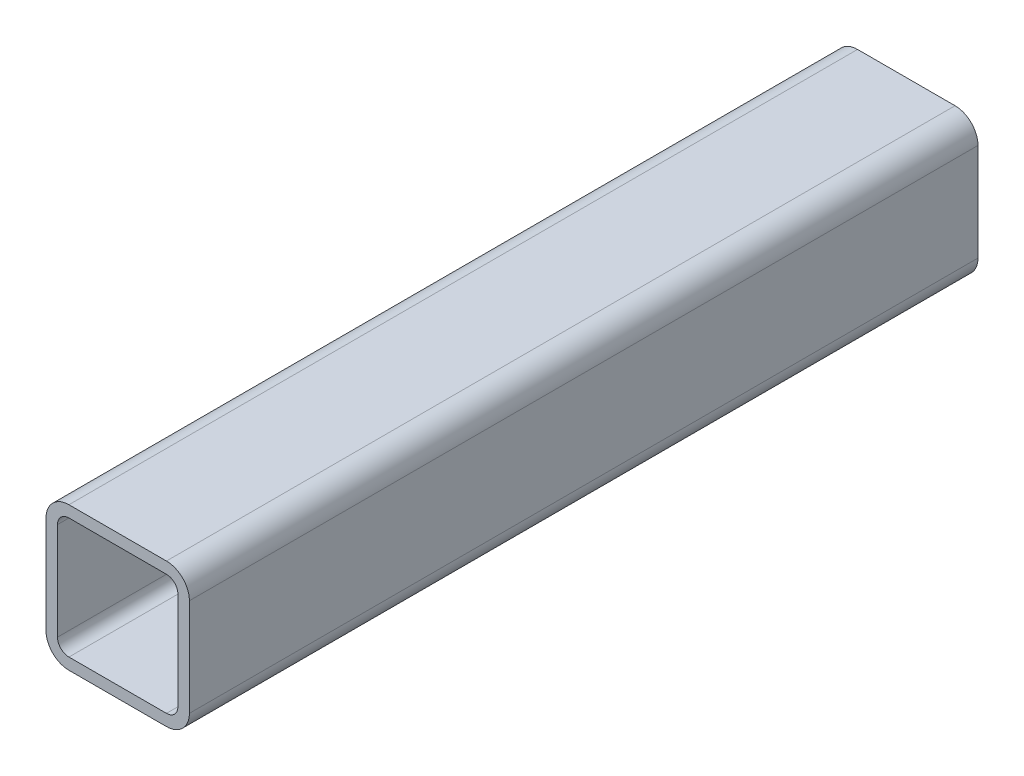
ISO-10303-21;
HEADER;
FILE_DESCRIPTION(('STEP AP214'),'2;1');
FILE_NAME('part.step','',(''),(''),'','','');
FILE_SCHEMA(('AUTOMOTIVE_DESIGN { 1 0 10303 214 1 1 1 1 }'));
ENDSEC;
DATA;
#1=APPLICATION_CONTEXT('core data for automotive mechanical design processes');
#2=APPLICATION_PROTOCOL_DEFINITION('international standard','automotive_design',2000,#1);
#3=PRODUCT_CONTEXT('',#1,'mechanical');
#4=PRODUCT('Part','Part','',(#3));
#5=PRODUCT_RELATED_PRODUCT_CATEGORY('part','',(#4));
#6=PRODUCT_DEFINITION_FORMATION('','',#4);
#7=PRODUCT_DEFINITION_CONTEXT('part definition',#1,'design');
#8=PRODUCT_DEFINITION('design','',#6,#7);
#9=PRODUCT_DEFINITION_SHAPE('','',#8);
#10=(LENGTH_UNIT() NAMED_UNIT(*) SI_UNIT(.MILLI.,.METRE.));
#11=(NAMED_UNIT(*) PLANE_ANGLE_UNIT() SI_UNIT($,.RADIAN.));
#12=(NAMED_UNIT(*) SI_UNIT($,.STERADIAN.) SOLID_ANGLE_UNIT());
#13=UNCERTAINTY_MEASURE_WITH_UNIT(LENGTH_MEASURE(1.E-05),#10,'distance_accuracy_value','');
#14=(GEOMETRIC_REPRESENTATION_CONTEXT(3) GLOBAL_UNCERTAINTY_ASSIGNED_CONTEXT((#13)) GLOBAL_UNIT_ASSIGNED_CONTEXT((#10,
#11,#12)) REPRESENTATION_CONTEXT('',''));
#15=CARTESIAN_POINT('',(0.,0.,0.));
#16=DIRECTION('',(0.,0.,1.));
#17=DIRECTION('',(1.,0.,0.));
#18=AXIS2_PLACEMENT_3D('',#15,#16,#17);
#19=CARTESIAN_POINT('',(-379.733333333333,896.4,620.));
#20=DIRECTION('',(0.,0.,1.));
#21=DIRECTION('',(1.,0.,0.));
#22=AXIS2_PLACEMENT_3D('',#19,#20,#21);
#23=CYLINDRICAL_SURFACE('',#22,6.39999999999996);
#24=CARTESIAN_POINT('',(-379.733333333333,896.4,860.));
#25=DIRECTION('',(0.,0.,1.));
#26=DIRECTION('',(1.,0.,0.));
#27=AXIS2_PLACEMENT_3D('',#24,#25,#26);
#28=CIRCLE('',#27,6.39999999999996);
#29=CARTESIAN_POINT('',(-379.733333333333,890.,860.));
#30=VERTEX_POINT('',#29);
#31=CARTESIAN_POINT('',(-373.333333333333,896.4,860.));
#32=VERTEX_POINT('',#31);
#33=EDGE_CURVE('E121',#30,#32,#28,.T.);
#34=ORIENTED_EDGE('',*,*,#33,.F.);
#35=DIRECTION('',(0.,0.,1.));
#36=VECTOR('',#35,1.);
#37=CARTESIAN_POINT('',(-379.733333333333,890.,620.));
#38=LINE('',#37,#36);
#39=CARTESIAN_POINT('',(-379.733333333333,890.,640.));
#40=VERTEX_POINT('',#39);
#41=EDGE_CURVE('E118',#30,#40,#38,.F.);
#42=ORIENTED_EDGE('',*,*,#41,.T.);
#43=CARTESIAN_POINT('',(-379.733333333333,896.4,640.));
#44=DIRECTION('',(0.,0.,1.));
#45=DIRECTION('',(1.,0.,0.));
#46=AXIS2_PLACEMENT_3D('',#43,#44,#45);
#47=CIRCLE('',#46,6.39999999999996);
#48=CARTESIAN_POINT('',(-373.333333333333,896.4,640.));
#49=VERTEX_POINT('',#48);
#50=EDGE_CURVE('E22',#49,#40,#47,.F.);
#51=ORIENTED_EDGE('',*,*,#50,.F.);
#52=DIRECTION('',(0.,0.,1.));
#53=VECTOR('',#52,1.);
#54=CARTESIAN_POINT('',(-373.333333333333,896.4,620.));
#55=LINE('',#54,#53);
#56=EDGE_CURVE('E218',#49,#32,#55,.T.);
#57=ORIENTED_EDGE('',*,*,#56,.T.);
#58=EDGE_LOOP('',(#34,#42,#51,#57));
#59=FACE_BOUND('',#58,.T.);
#60=ADVANCED_FACE('F19',(#59),#23,.T.);
#61=CARTESIAN_POINT('',(-373.333333333333,896.4,620.));
#62=DIRECTION('',(-1.,0.,0.));
#63=DIRECTION('',(0.,0.,1.));
#64=AXIS2_PLACEMENT_3D('',#61,#62,#63);
#65=PLANE('',#64);
#66=DIRECTION('',(0.,1.,0.));
#67=VECTOR('',#66,1.);
#68=CARTESIAN_POINT('',(-373.333333333333,896.4,640.));
#69=LINE('',#68,#67);
#70=CARTESIAN_POINT('',(-373.333333333333,923.6,640.));
#71=VERTEX_POINT('',#70);
#72=EDGE_CURVE('E140',#71,#49,#69,.F.);
#73=ORIENTED_EDGE('',*,*,#72,.F.);
#74=DIRECTION('',(0.,0.,1.));
#75=VECTOR('',#74,1.);
#76=CARTESIAN_POINT('',(-373.333333333333,923.6,620.));
#77=LINE('',#76,#75);
#78=CARTESIAN_POINT('',(-373.333333333333,923.6,860.));
#79=VERTEX_POINT('',#78);
#80=EDGE_CURVE('E217',#79,#71,#77,.F.);
#81=ORIENTED_EDGE('',*,*,#80,.F.);
#82=DIRECTION('',(0.,-1.,0.));
#83=VECTOR('',#82,1.);
#84=CARTESIAN_POINT('',(-373.333333333333,910.,860.));
#85=LINE('',#84,#83);
#86=EDGE_CURVE('E194',#32,#79,#85,.F.);
#87=ORIENTED_EDGE('',*,*,#86,.F.);
#88=ORIENTED_EDGE('',*,*,#56,.F.);
#89=EDGE_LOOP('',(#73,#81,#87,#88));
#90=FACE_BOUND('',#89,.T.);
#91=ADVANCED_FACE('F279',(#90),#65,.F.);
#92=CARTESIAN_POINT('',(-379.733333333333,923.6,620.));
#93=DIRECTION('',(0.,0.,1.));
#94=DIRECTION('',(1.,0.,0.));
#95=AXIS2_PLACEMENT_3D('',#92,#93,#94);
#96=CYLINDRICAL_SURFACE('',#95,6.39999999999996);
#97=CARTESIAN_POINT('',(-379.733333333333,923.6,860.));
#98=DIRECTION('',(0.,0.,1.));
#99=DIRECTION('',(1.,0.,0.));
#100=AXIS2_PLACEMENT_3D('',#97,#98,#99);
#101=CIRCLE('',#100,6.39999999999996);
#102=CARTESIAN_POINT('',(-379.733333333333,930.,860.));
#103=VERTEX_POINT('',#102);
#104=EDGE_CURVE('E242',#79,#103,#101,.T.);
#105=ORIENTED_EDGE('',*,*,#104,.F.);
#106=ORIENTED_EDGE('',*,*,#80,.T.);
#107=CARTESIAN_POINT('',(-379.733333333333,923.6,640.));
#108=DIRECTION('',(0.,0.,1.));
#109=DIRECTION('',(1.,0.,0.));
#110=AXIS2_PLACEMENT_3D('',#107,#108,#109);
#111=CIRCLE('',#110,6.39999999999996);
#112=CARTESIAN_POINT('',(-379.733333333333,930.,640.));
#113=VERTEX_POINT('',#112);
#114=EDGE_CURVE('E170',#113,#71,#111,.F.);
#115=ORIENTED_EDGE('',*,*,#114,.F.);
#116=DIRECTION('',(0.,0.,-1.));
#117=VECTOR('',#116,1.);
#118=CARTESIAN_POINT('',(-379.733333333333,930.,620.));
#119=LINE('',#118,#117);
#120=EDGE_CURVE('E215',#113,#103,#119,.F.);
#121=ORIENTED_EDGE('',*,*,#120,.T.);
#122=EDGE_LOOP('',(#105,#106,#115,#121));
#123=FACE_BOUND('',#122,.T.);
#124=ADVANCED_FACE('F275',(#123),#96,.T.);
#125=CARTESIAN_POINT('',(-406.933333333334,930.,620.));
#126=DIRECTION('',(0.,-1.,0.));
#127=DIRECTION('',(0.,0.,-1.));
#128=AXIS2_PLACEMENT_3D('',#125,#126,#127);
#129=PLANE('',#128);
#130=DIRECTION('',(1.,0.,0.));
#131=VECTOR('',#130,1.);
#132=CARTESIAN_POINT('',(1180.,930.,640.));
#133=LINE('',#132,#131);
#134=CARTESIAN_POINT('',(-406.933333333334,930.,640.));
#135=VERTEX_POINT('',#134);
#136=EDGE_CURVE('E166',#135,#113,#133,.T.);
#137=ORIENTED_EDGE('',*,*,#136,.F.);
#138=DIRECTION('',(0.,0.,1.));
#139=VECTOR('',#138,1.);
#140=CARTESIAN_POINT('',(-406.933333333334,930.,620.));
#141=LINE('',#140,#139);
#142=CARTESIAN_POINT('',(-406.933333333333,930.,860.));
#143=VERTEX_POINT('',#142);
#144=EDGE_CURVE('E213',#143,#135,#141,.F.);
#145=ORIENTED_EDGE('',*,*,#144,.F.);
#146=DIRECTION('',(1.,0.,0.));
#147=VECTOR('',#146,1.);
#148=CARTESIAN_POINT('',(-406.933333333333,930.,860.));
#149=LINE('',#148,#147);
#150=EDGE_CURVE('E241',#103,#143,#149,.F.);
#151=ORIENTED_EDGE('',*,*,#150,.F.);
#152=ORIENTED_EDGE('',*,*,#120,.F.);
#153=EDGE_LOOP('',(#137,#145,#151,#152));
#154=FACE_BOUND('',#153,.T.);
#155=ADVANCED_FACE('F270',(#154),#129,.F.);
#156=CARTESIAN_POINT('',(-406.933333333334,923.6,620.));
#157=DIRECTION('',(0.,0.,1.));
#158=DIRECTION('',(1.,0.,0.));
#159=AXIS2_PLACEMENT_3D('',#156,#157,#158);
#160=CYLINDRICAL_SURFACE('',#159,6.39999999999996);
#161=CARTESIAN_POINT('',(-406.933333333333,923.6,860.));
#162=DIRECTION('',(0.,0.,1.));
#163=DIRECTION('',(1.,0.,0.));
#164=AXIS2_PLACEMENT_3D('',#161,#162,#163);
#165=CIRCLE('',#164,6.39999999999996);
#166=CARTESIAN_POINT('',(-413.333333333333,923.6,860.));
#167=VERTEX_POINT('',#166);
#168=EDGE_CURVE('E238',#143,#167,#165,.T.);
#169=ORIENTED_EDGE('',*,*,#168,.F.);
#170=ORIENTED_EDGE('',*,*,#144,.T.);
#171=CARTESIAN_POINT('',(-406.933333333333,923.6,640.));
#172=DIRECTION('',(0.,0.,1.));
#173=DIRECTION('',(1.,0.,0.));
#174=AXIS2_PLACEMENT_3D('',#171,#172,#173);
#175=CIRCLE('',#174,6.39999999999996);
#176=CARTESIAN_POINT('',(-413.333333333333,923.6,640.));
#177=VERTEX_POINT('',#176);
#178=EDGE_CURVE('E165',#177,#135,#175,.F.);
#179=ORIENTED_EDGE('',*,*,#178,.F.);
#180=DIRECTION('',(0.,0.,-1.));
#181=VECTOR('',#180,1.);
#182=CARTESIAN_POINT('',(-413.333333333333,923.6,620.));
#183=LINE('',#182,#181);
#184=EDGE_CURVE('E211',#177,#167,#183,.F.);
#185=ORIENTED_EDGE('',*,*,#184,.T.);
#186=EDGE_LOOP('',(#169,#170,#179,#185));
#187=FACE_BOUND('',#186,.T.);
#188=ADVANCED_FACE('F266',(#187),#160,.T.);
#189=CARTESIAN_POINT('',(-413.333333333333,923.6,620.));
#190=DIRECTION('',(1.,0.,0.));
#191=DIRECTION('',(0.,0.,-1.));
#192=AXIS2_PLACEMENT_3D('',#189,#190,#191);
#193=PLANE('',#192);
#194=DIRECTION('',(0.,1.,0.));
#195=VECTOR('',#194,1.);
#196=CARTESIAN_POINT('',(-413.333333333333,896.4,640.));
#197=LINE('',#196,#195);
#198=CARTESIAN_POINT('',(-413.333333333333,896.4,640.));
#199=VERTEX_POINT('',#198);
#200=EDGE_CURVE('E162',#199,#177,#197,.T.);
#201=ORIENTED_EDGE('',*,*,#200,.F.);
#202=DIRECTION('',(0.,0.,1.));
#203=VECTOR('',#202,1.);
#204=CARTESIAN_POINT('',(-413.333333333333,896.4,620.));
#205=LINE('',#204,#203);
#206=CARTESIAN_POINT('',(-413.333333333333,896.4,860.));
#207=VERTEX_POINT('',#206);
#208=EDGE_CURVE('E126',#207,#199,#205,.F.);
#209=ORIENTED_EDGE('',*,*,#208,.F.);
#210=DIRECTION('',(0.,-1.,0.));
#211=VECTOR('',#210,1.);
#212=CARTESIAN_POINT('',(-413.333333333333,910.,860.));
#213=LINE('',#212,#211);
#214=EDGE_CURVE('E237',#167,#207,#213,.T.);
#215=ORIENTED_EDGE('',*,*,#214,.F.);
#216=ORIENTED_EDGE('',*,*,#184,.F.);
#217=EDGE_LOOP('',(#201,#209,#215,#216));
#218=FACE_BOUND('',#217,.T.);
#219=ADVANCED_FACE('F262',(#218),#193,.F.);
#220=CARTESIAN_POINT('',(-406.933333333334,896.4,620.));
#221=DIRECTION('',(0.,0.,1.));
#222=DIRECTION('',(1.,0.,0.));
#223=AXIS2_PLACEMENT_3D('',#220,#221,#222);
#224=CYLINDRICAL_SURFACE('',#223,6.40000000000002);
#225=CARTESIAN_POINT('',(-406.933333333333,896.4,860.));
#226=DIRECTION('',(0.,0.,1.));
#227=DIRECTION('',(1.,0.,0.));
#228=AXIS2_PLACEMENT_3D('',#225,#226,#227);
#229=CIRCLE('',#228,6.40000000000002);
#230=CARTESIAN_POINT('',(-406.933333333333,890.,860.));
#231=VERTEX_POINT('',#230);
#232=EDGE_CURVE('E234',#207,#231,#229,.T.);
#233=ORIENTED_EDGE('',*,*,#232,.F.);
#234=ORIENTED_EDGE('',*,*,#208,.T.);
#235=CARTESIAN_POINT('',(-406.933333333333,896.4,640.));
#236=DIRECTION('',(0.,0.,1.));
#237=DIRECTION('',(1.,0.,0.));
#238=AXIS2_PLACEMENT_3D('',#235,#236,#237);
#239=CIRCLE('',#238,6.40000000000002);
#240=CARTESIAN_POINT('',(-406.933333333333,890.,640.));
#241=VERTEX_POINT('',#240);
#242=EDGE_CURVE('E134',#241,#199,#239,.F.);
#243=ORIENTED_EDGE('',*,*,#242,.F.);
#244=DIRECTION('',(0.,0.,1.));
#245=VECTOR('',#244,1.);
#246=CARTESIAN_POINT('',(-406.933333333333,890.,620.));
#247=LINE('',#246,#245);
#248=EDGE_CURVE('E125',#241,#231,#247,.T.);
#249=ORIENTED_EDGE('',*,*,#248,.T.);
#250=EDGE_LOOP('',(#233,#234,#243,#249));
#251=FACE_BOUND('',#250,.T.);
#252=ADVANCED_FACE('F258',(#251),#224,.T.);
#253=CARTESIAN_POINT('',(-379.733333333333,890.,620.));
#254=DIRECTION('',(0.,1.,0.));
#255=DIRECTION('',(0.,0.,1.));
#256=AXIS2_PLACEMENT_3D('',#253,#254,#255);
#257=PLANE('',#256);
#258=DIRECTION('',(1.,0.,0.));
#259=VECTOR('',#258,1.);
#260=CARTESIAN_POINT('',(1180.,890.,640.));
#261=LINE('',#260,#259);
#262=EDGE_CURVE('E129',#40,#241,#261,.F.);
#263=ORIENTED_EDGE('',*,*,#262,.F.);
#264=ORIENTED_EDGE('',*,*,#41,.F.);
#265=DIRECTION('',(1.,0.,0.));
#266=VECTOR('',#265,1.);
#267=CARTESIAN_POINT('',(-406.933333333333,890.,860.));
#268=LINE('',#267,#266);
#269=EDGE_CURVE('E233',#231,#30,#268,.T.);
#270=ORIENTED_EDGE('',*,*,#269,.F.);
#271=ORIENTED_EDGE('',*,*,#248,.F.);
#272=EDGE_LOOP('',(#263,#264,#270,#271));
#273=FACE_BOUND('',#272,.T.);
#274=ADVANCED_FACE('F130',(#273),#257,.F.);
#275=CARTESIAN_POINT('',(-410.133333333333,923.6,620.));
#276=DIRECTION('',(1.,0.,0.));
#277=DIRECTION('',(0.,0.,-1.));
#278=AXIS2_PLACEMENT_3D('',#275,#276,#277);
#279=PLANE('',#278);
#280=DIRECTION('',(0.,0.,1.));
#281=VECTOR('',#280,1.);
#282=CARTESIAN_POINT('',(-410.133333333333,923.6,620.));
#283=LINE('',#282,#281);
#284=CARTESIAN_POINT('',(-410.133333333333,923.6,640.));
#285=VERTEX_POINT('',#284);
#286=CARTESIAN_POINT('',(-410.133333333333,923.6,860.));
#287=VERTEX_POINT('',#286);
#288=EDGE_CURVE('E201',#285,#287,#283,.T.);
#289=ORIENTED_EDGE('',*,*,#288,.T.);
#290=DIRECTION('',(0.,-1.,0.));
#291=VECTOR('',#290,1.);
#292=CARTESIAN_POINT('',(-410.133333333333,910.,860.));
#293=LINE('',#292,#291);
#294=CARTESIAN_POINT('',(-410.133333333333,896.4,860.));
#295=VERTEX_POINT('',#294);
#296=EDGE_CURVE('E231',#295,#287,#293,.F.);
#297=ORIENTED_EDGE('',*,*,#296,.F.);
#298=DIRECTION('',(0.,0.,1.));
#299=VECTOR('',#298,1.);
#300=CARTESIAN_POINT('',(-410.133333333333,896.4,620.));
#301=LINE('',#300,#299);
#302=CARTESIAN_POINT('',(-410.133333333333,896.4,640.));
#303=VERTEX_POINT('',#302);
#304=EDGE_CURVE('E205',#295,#303,#301,.F.);
#305=ORIENTED_EDGE('',*,*,#304,.T.);
#306=DIRECTION('',(0.,1.,0.));
#307=VECTOR('',#306,1.);
#308=CARTESIAN_POINT('',(-410.133333333333,896.4,640.));
#309=LINE('',#308,#307);
#310=EDGE_CURVE('E172',#285,#303,#309,.F.);
#311=ORIENTED_EDGE('',*,*,#310,.F.);
#312=EDGE_LOOP('',(#289,#297,#305,#311));
#313=FACE_BOUND('',#312,.T.);
#314=ADVANCED_FACE('F314',(#313),#279,.T.);
#315=CARTESIAN_POINT('',(-406.933333333334,923.6,620.));
#316=DIRECTION('',(0.,0.,1.));
#317=DIRECTION('',(1.,0.,0.));
#318=AXIS2_PLACEMENT_3D('',#315,#316,#317);
#319=CYLINDRICAL_SURFACE('',#318,3.19999999999993);
#320=ORIENTED_EDGE('',*,*,#288,.F.);
#321=CARTESIAN_POINT('',(-406.933333333333,923.6,640.));
#322=DIRECTION('',(0.,0.,1.));
#323=DIRECTION('',(1.,0.,0.));
#324=AXIS2_PLACEMENT_3D('',#321,#322,#323);
#325=CIRCLE('',#324,3.19999999999993);
#326=CARTESIAN_POINT('',(-406.933333333333,926.8,640.));
#327=VERTEX_POINT('',#326);
#328=EDGE_CURVE('E183',#327,#285,#325,.T.);
#329=ORIENTED_EDGE('',*,*,#328,.F.);
#330=DIRECTION('',(0.,0.,-1.));
#331=VECTOR('',#330,1.);
#332=CARTESIAN_POINT('',(-406.933333333333,926.8,620.));
#333=LINE('',#332,#331);
#334=CARTESIAN_POINT('',(-406.933333333333,926.8,860.));
#335=VERTEX_POINT('',#334);
#336=EDGE_CURVE('E200',#335,#327,#333,.T.);
#337=ORIENTED_EDGE('',*,*,#336,.F.);
#338=CARTESIAN_POINT('',(-406.933333333333,923.6,860.));
#339=DIRECTION('',(0.,0.,1.));
#340=DIRECTION('',(1.,0.,0.));
#341=AXIS2_PLACEMENT_3D('',#338,#339,#340);
#342=CIRCLE('',#341,3.19999999999993);
#343=EDGE_CURVE('E228',#287,#335,#342,.F.);
#344=ORIENTED_EDGE('',*,*,#343,.F.);
#345=EDGE_LOOP('',(#320,#329,#337,#344));
#346=FACE_BOUND('',#345,.T.);
#347=ADVANCED_FACE('F310',(#346),#319,.F.);
#348=CARTESIAN_POINT('',(-406.933333333334,926.8,620.));
#349=DIRECTION('',(0.,-1.,0.));
#350=DIRECTION('',(0.,0.,-1.));
#351=AXIS2_PLACEMENT_3D('',#348,#349,#350);
#352=PLANE('',#351);
#353=DIRECTION('',(0.,0.,1.));
#354=VECTOR('',#353,1.);
#355=CARTESIAN_POINT('',(-379.733333333333,926.8,620.));
#356=LINE('',#355,#354);
#357=CARTESIAN_POINT('',(-379.733333333333,926.8,640.));
#358=VERTEX_POINT('',#357);
#359=CARTESIAN_POINT('',(-379.733333333333,926.8,860.));
#360=VERTEX_POINT('',#359);
#361=EDGE_CURVE('E150',#358,#360,#356,.T.);
#362=ORIENTED_EDGE('',*,*,#361,.T.);
#363=DIRECTION('',(1.,0.,0.));
#364=VECTOR('',#363,1.);
#365=CARTESIAN_POINT('',(-406.933333333333,926.8,860.));
#366=LINE('',#365,#364);
#367=EDGE_CURVE('E227',#335,#360,#366,.T.);
#368=ORIENTED_EDGE('',*,*,#367,.F.);
#369=ORIENTED_EDGE('',*,*,#336,.T.);
#370=DIRECTION('',(1.,0.,0.));
#371=VECTOR('',#370,1.);
#372=CARTESIAN_POINT('',(1180.,926.8,640.));
#373=LINE('',#372,#371);
#374=EDGE_CURVE('E180',#358,#327,#373,.F.);
#375=ORIENTED_EDGE('',*,*,#374,.F.);
#376=EDGE_LOOP('',(#362,#368,#369,#375));
#377=FACE_BOUND('',#376,.T.);
#378=ADVANCED_FACE('F313',(#377),#352,.T.);
#379=CARTESIAN_POINT('',(-379.733333333333,923.6,620.));
#380=DIRECTION('',(0.,0.,1.));
#381=DIRECTION('',(1.,0.,0.));
#382=AXIS2_PLACEMENT_3D('',#379,#380,#381);
#383=CYLINDRICAL_SURFACE('',#382,3.19999999999993);
#384=ORIENTED_EDGE('',*,*,#361,.F.);
#385=CARTESIAN_POINT('',(-379.733333333333,923.6,640.));
#386=DIRECTION('',(0.,0.,1.));
#387=DIRECTION('',(1.,0.,0.));
#388=AXIS2_PLACEMENT_3D('',#385,#386,#387);
#389=CIRCLE('',#388,3.19999999999993);
#390=CARTESIAN_POINT('',(-376.533333333333,923.6,640.));
#391=VERTEX_POINT('',#390);
#392=EDGE_CURVE('E179',#391,#358,#389,.T.);
#393=ORIENTED_EDGE('',*,*,#392,.F.);
#394=DIRECTION('',(0.,0.,1.));
#395=VECTOR('',#394,1.);
#396=CARTESIAN_POINT('',(-376.533333333333,923.6,620.));
#397=LINE('',#396,#395);
#398=CARTESIAN_POINT('',(-376.533333333333,923.6,860.));
#399=VERTEX_POINT('',#398);
#400=EDGE_CURVE('E143',#399,#391,#397,.F.);
#401=ORIENTED_EDGE('',*,*,#400,.F.);
#402=CARTESIAN_POINT('',(-379.733333333333,923.6,860.));
#403=DIRECTION('',(0.,0.,1.));
#404=DIRECTION('',(1.,0.,0.));
#405=AXIS2_PLACEMENT_3D('',#402,#403,#404);
#406=CIRCLE('',#405,3.19999999999993);
#407=EDGE_CURVE('E224',#360,#399,#406,.F.);
#408=ORIENTED_EDGE('',*,*,#407,.F.);
#409=EDGE_LOOP('',(#384,#393,#401,#408));
#410=FACE_BOUND('',#409,.T.);
#411=ADVANCED_FACE('F332',(#410),#383,.F.);
#412=CARTESIAN_POINT('',(-376.533333333333,896.4,620.));
#413=DIRECTION('',(-1.,0.,0.));
#414=DIRECTION('',(0.,0.,1.));
#415=AXIS2_PLACEMENT_3D('',#412,#413,#414);
#416=PLANE('',#415);
#417=DIRECTION('',(0.,0.,1.));
#418=VECTOR('',#417,1.);
#419=CARTESIAN_POINT('',(-376.533333333333,896.4,620.));
#420=LINE('',#419,#418);
#421=CARTESIAN_POINT('',(-376.533333333333,896.4,640.));
#422=VERTEX_POINT('',#421);
#423=CARTESIAN_POINT('',(-376.533333333333,896.4,860.));
#424=VERTEX_POINT('',#423);
#425=EDGE_CURVE('E141',#422,#424,#420,.T.);
#426=ORIENTED_EDGE('',*,*,#425,.T.);
#427=DIRECTION('',(0.,-1.,0.));
#428=VECTOR('',#427,1.);
#429=CARTESIAN_POINT('',(-376.533333333333,910.,860.));
#430=LINE('',#429,#428);
#431=EDGE_CURVE('E223',#399,#424,#430,.T.);
#432=ORIENTED_EDGE('',*,*,#431,.F.);
#433=ORIENTED_EDGE('',*,*,#400,.T.);
#434=DIRECTION('',(0.,1.,0.));
#435=VECTOR('',#434,1.);
#436=CARTESIAN_POINT('',(-376.533333333333,896.4,640.));
#437=LINE('',#436,#435);
#438=EDGE_CURVE('E176',#422,#391,#437,.T.);
#439=ORIENTED_EDGE('',*,*,#438,.F.);
#440=EDGE_LOOP('',(#426,#432,#433,#439));
#441=FACE_BOUND('',#440,.T.);
#442=ADVANCED_FACE('F294',(#441),#416,.T.);
#443=CARTESIAN_POINT('',(-379.733333333333,896.4,620.));
#444=DIRECTION('',(0.,0.,1.));
#445=DIRECTION('',(1.,0.,0.));
#446=AXIS2_PLACEMENT_3D('',#443,#444,#445);
#447=CYLINDRICAL_SURFACE('',#446,3.19999999999993);
#448=ORIENTED_EDGE('',*,*,#425,.F.);
#449=CARTESIAN_POINT('',(-379.733333333333,896.4,640.));
#450=DIRECTION('',(0.,0.,1.));
#451=DIRECTION('',(1.,0.,0.));
#452=AXIS2_PLACEMENT_3D('',#449,#450,#451);
#453=CIRCLE('',#452,3.19999999999993);
#454=CARTESIAN_POINT('',(-379.733333333332,893.2,640.));
#455=VERTEX_POINT('',#454);
#456=EDGE_CURVE('E175',#455,#422,#453,.T.);
#457=ORIENTED_EDGE('',*,*,#456,.F.);
#458=DIRECTION('',(0.,0.,1.));
#459=VECTOR('',#458,1.);
#460=CARTESIAN_POINT('',(-379.733333333331,893.2,620.));
#461=LINE('',#460,#459);
#462=CARTESIAN_POINT('',(-379.733333333332,893.2,860.));
#463=VERTEX_POINT('',#462);
#464=EDGE_CURVE('E187',#463,#455,#461,.F.);
#465=ORIENTED_EDGE('',*,*,#464,.F.);
#466=CARTESIAN_POINT('',(-379.733333333333,896.4,860.));
#467=DIRECTION('',(0.,0.,1.));
#468=DIRECTION('',(1.,0.,0.));
#469=AXIS2_PLACEMENT_3D('',#466,#467,#468);
#470=CIRCLE('',#469,3.19999999999993);
#471=EDGE_CURVE('E189',#424,#463,#470,.F.);
#472=ORIENTED_EDGE('',*,*,#471,.F.);
#473=EDGE_LOOP('',(#448,#457,#465,#472));
#474=FACE_BOUND('',#473,.T.);
#475=ADVANCED_FACE('F323',(#474),#447,.F.);
#476=CARTESIAN_POINT('',(1180.,896.4,640.));
#477=DIRECTION('',(0.,0.,-1.));
#478=DIRECTION('',(0.,1.,0.));
#479=AXIS2_PLACEMENT_3D('',#476,#477,#478);
#480=PLANE('',#479);
#481=ORIENTED_EDGE('',*,*,#374,.T.);
#482=ORIENTED_EDGE('',*,*,#328,.T.);
#483=ORIENTED_EDGE('',*,*,#310,.T.);
#484=CARTESIAN_POINT('',(-406.933333333333,896.4,640.));
#485=DIRECTION('',(0.,0.,1.));
#486=DIRECTION('',(1.,0.,0.));
#487=AXIS2_PLACEMENT_3D('',#484,#485,#486);
#488=CIRCLE('',#487,3.19999999999998);
#489=CARTESIAN_POINT('',(-406.933333333334,893.2,640.));
#490=VERTEX_POINT('',#489);
#491=EDGE_CURVE('E207',#303,#490,#488,.T.);
#492=ORIENTED_EDGE('',*,*,#491,.T.);
#493=DIRECTION('',(1.,0.,0.));
#494=VECTOR('',#493,1.);
#495=CARTESIAN_POINT('',(-379.733333333333,893.2,640.));
#496=LINE('',#495,#494);
#497=EDGE_CURVE('E184',#455,#490,#496,.F.);
#498=ORIENTED_EDGE('',*,*,#497,.F.);
#499=ORIENTED_EDGE('',*,*,#456,.T.);
#500=ORIENTED_EDGE('',*,*,#438,.T.);
#501=ORIENTED_EDGE('',*,*,#392,.T.);
#502=EDGE_LOOP('',(#481,#482,#483,#492,#498,#499,#500,#501));
#503=FACE_BOUND('',#502,.T.);
#504=ORIENTED_EDGE('',*,*,#114,.T.);
#505=ORIENTED_EDGE('',*,*,#72,.T.);
#506=ORIENTED_EDGE('',*,*,#50,.T.);
#507=ORIENTED_EDGE('',*,*,#262,.T.);
#508=ORIENTED_EDGE('',*,*,#242,.T.);
#509=ORIENTED_EDGE('',*,*,#200,.T.);
#510=ORIENTED_EDGE('',*,*,#178,.T.);
#511=ORIENTED_EDGE('',*,*,#136,.T.);
#512=EDGE_LOOP('',(#504,#505,#506,#507,#508,#509,#510,#511));
#513=FACE_BOUND('',#512,.T.);
#514=ADVANCED_FACE('F138',(#503,#513),#480,.T.);
#515=CARTESIAN_POINT('',(-406.933333333334,896.4,620.));
#516=DIRECTION('',(0.,0.,1.));
#517=DIRECTION('',(1.,0.,0.));
#518=AXIS2_PLACEMENT_3D('',#515,#516,#517);
#519=CYLINDRICAL_SURFACE('',#518,3.19999999999998);
#520=DIRECTION('',(0.,0.,1.));
#521=VECTOR('',#520,1.);
#522=CARTESIAN_POINT('',(-406.933333333335,893.2,620.));
#523=LINE('',#522,#521);
#524=CARTESIAN_POINT('',(-406.933333333334,893.2,860.));
#525=VERTEX_POINT('',#524);
#526=EDGE_CURVE('E28',#490,#525,#523,.T.);
#527=ORIENTED_EDGE('',*,*,#526,.F.);
#528=ORIENTED_EDGE('',*,*,#491,.F.);
#529=ORIENTED_EDGE('',*,*,#304,.F.);
#530=CARTESIAN_POINT('',(-406.933333333333,896.4,860.));
#531=DIRECTION('',(0.,0.,1.));
#532=DIRECTION('',(1.,0.,0.));
#533=AXIS2_PLACEMENT_3D('',#530,#531,#532);
#534=CIRCLE('',#533,3.19999999999998);
#535=EDGE_CURVE('E37',#525,#295,#534,.F.);
#536=ORIENTED_EDGE('',*,*,#535,.F.);
#537=EDGE_LOOP('',(#527,#528,#529,#536));
#538=FACE_BOUND('',#537,.T.);
#539=ADVANCED_FACE('F318',(#538),#519,.F.);
#540=CARTESIAN_POINT('',(-406.933333333333,910.,860.));
#541=DIRECTION('',(0.,0.,1.));
#542=DIRECTION('',(0.,-1.,0.));
#543=AXIS2_PLACEMENT_3D('',#540,#541,#542);
#544=PLANE('',#543);
#545=ORIENTED_EDGE('',*,*,#471,.T.);
#546=DIRECTION('',(1.,0.,0.));
#547=VECTOR('',#546,1.);
#548=CARTESIAN_POINT('',(-379.733333333333,893.2,860.));
#549=LINE('',#548,#547);
#550=EDGE_CURVE('E12',#525,#463,#549,.T.);
#551=ORIENTED_EDGE('',*,*,#550,.F.);
#552=ORIENTED_EDGE('',*,*,#535,.T.);
#553=ORIENTED_EDGE('',*,*,#296,.T.);
#554=ORIENTED_EDGE('',*,*,#343,.T.);
#555=ORIENTED_EDGE('',*,*,#367,.T.);
#556=ORIENTED_EDGE('',*,*,#407,.T.);
#557=ORIENTED_EDGE('',*,*,#431,.T.);
#558=EDGE_LOOP('',(#545,#551,#552,#553,#554,#555,#556,#557));
#559=FACE_BOUND('',#558,.T.);
#560=ORIENTED_EDGE('',*,*,#232,.T.);
#561=ORIENTED_EDGE('',*,*,#269,.T.);
#562=ORIENTED_EDGE('',*,*,#33,.T.);
#563=ORIENTED_EDGE('',*,*,#86,.T.);
#564=ORIENTED_EDGE('',*,*,#104,.T.);
#565=ORIENTED_EDGE('',*,*,#150,.T.);
#566=ORIENTED_EDGE('',*,*,#168,.T.);
#567=ORIENTED_EDGE('',*,*,#214,.T.);
#568=EDGE_LOOP('',(#560,#561,#562,#563,#564,#565,#566,#567));
#569=FACE_BOUND('',#568,.T.);
#570=ADVANCED_FACE('F281',(#559,#569),#544,.T.);
#571=CARTESIAN_POINT('',(-379.733333333333,893.2,620.));
#572=DIRECTION('',(0.,1.,0.));
#573=DIRECTION('',(0.,0.,1.));
#574=AXIS2_PLACEMENT_3D('',#571,#572,#573);
#575=PLANE('',#574);
#576=ORIENTED_EDGE('',*,*,#526,.T.);
#577=ORIENTED_EDGE('',*,*,#550,.T.);
#578=ORIENTED_EDGE('',*,*,#464,.T.);
#579=ORIENTED_EDGE('',*,*,#497,.T.);
#580=EDGE_LOOP('',(#576,#577,#578,#579));
#581=FACE_BOUND('',#580,.T.);
#582=ADVANCED_FACE('F320',(#581),#575,.T.);
#583=CLOSED_SHELL('',(#60,#91,#124,#155,#188,#219,#252,#274,#314,#347,#378,#411,#442,#475,#514,
#539,#570,#582));
#584=MANIFOLD_SOLID_BREP('B1',#583);
#585=ADVANCED_BREP_SHAPE_REPRESENTATION('',(#18,#584),#14);
#586=SHAPE_DEFINITION_REPRESENTATION(#9,#585);
ENDSEC;
END-ISO-10303-21;
